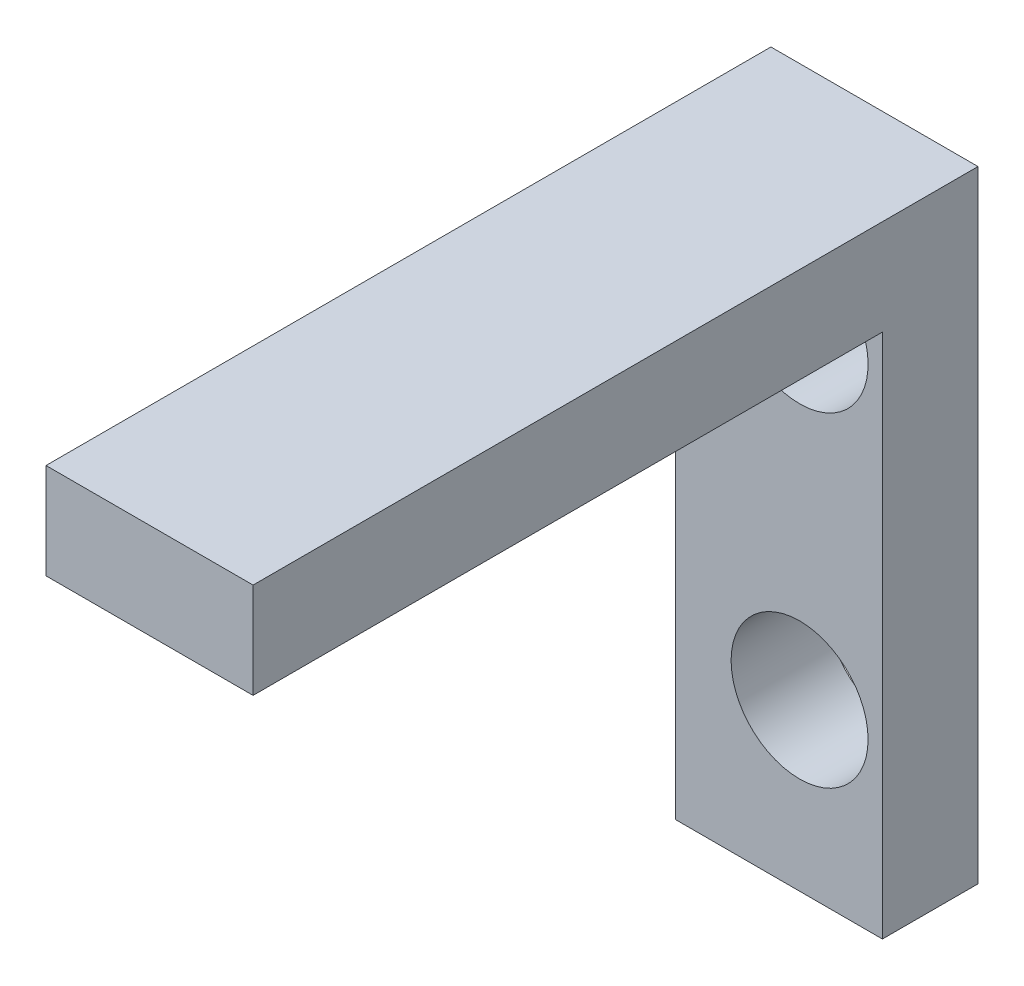
ISO-10303-21;
HEADER;
FILE_DESCRIPTION(('STEP AP214'),'2;1');
FILE_NAME('part.step','',(''),(''),'','','');
FILE_SCHEMA(('AUTOMOTIVE_DESIGN { 1 0 10303 214 1 1 1 1 }'));
ENDSEC;
DATA;
#1=APPLICATION_CONTEXT('core data for automotive mechanical design processes');
#2=APPLICATION_PROTOCOL_DEFINITION('international standard','automotive_design',2000,#1);
#3=PRODUCT_CONTEXT('',#1,'mechanical');
#4=PRODUCT('Part','Part','',(#3));
#5=PRODUCT_RELATED_PRODUCT_CATEGORY('part','',(#4));
#6=PRODUCT_DEFINITION_FORMATION('','',#4);
#7=PRODUCT_DEFINITION_CONTEXT('part definition',#1,'design');
#8=PRODUCT_DEFINITION('design','',#6,#7);
#9=PRODUCT_DEFINITION_SHAPE('','',#8);
#10=(LENGTH_UNIT() NAMED_UNIT(*) SI_UNIT(.MILLI.,.METRE.));
#11=(NAMED_UNIT(*) PLANE_ANGLE_UNIT() SI_UNIT($,.RADIAN.));
#12=(NAMED_UNIT(*) SI_UNIT($,.STERADIAN.) SOLID_ANGLE_UNIT());
#13=UNCERTAINTY_MEASURE_WITH_UNIT(LENGTH_MEASURE(1.E-05),#10,'distance_accuracy_value','');
#14=(GEOMETRIC_REPRESENTATION_CONTEXT(3) GLOBAL_UNCERTAINTY_ASSIGNED_CONTEXT((#13)) GLOBAL_UNIT_ASSIGNED_CONTEXT((#10,
#11,#12)) REPRESENTATION_CONTEXT('',''));
#15=CARTESIAN_POINT('',(0.,0.,0.));
#16=DIRECTION('',(0.,0.,1.));
#17=DIRECTION('',(1.,0.,0.));
#18=AXIS2_PLACEMENT_3D('',#15,#16,#17);
#19=CARTESIAN_POINT('',(0.,0.,3.));
#20=DIRECTION('',(0.,0.,1.));
#21=DIRECTION('',(1.,0.,0.));
#22=AXIS2_PLACEMENT_3D('',#19,#20,#21);
#23=PLANE('',#22);
#24=CARTESIAN_POINT('',(-30.1826296275651,-10.5210841512076,3.));
#25=DIRECTION('',(0.,0.,1.));
#26=DIRECTION('',(1.,0.,0.));
#27=AXIS2_PLACEMENT_3D('',#24,#25,#26);
#28=CIRCLE('',#27,2.15);
#29=CARTESIAN_POINT('',(-32.0300913961896,-9.42136372606727,3.));
#30=VERTEX_POINT('',#29);
#31=CARTESIAN_POINT('',(-28.3351678589407,-9.42136372606727,3.));
#32=VERTEX_POINT('',#31);
#33=EDGE_CURVE('E105',#30,#32,#28,.T.);
#34=ORIENTED_EDGE('',*,*,#33,.F.);
#35=DIRECTION('',(-1.,0.,0.));
#36=VECTOR('',#35,1.);
#37=CARTESIAN_POINT('',(-27.5826296275652,-9.42136372606727,3.));
#38=LINE('',#37,#36);
#39=CARTESIAN_POINT('',(-34.0826296275651,-9.42136372606727,3.));
#40=VERTEX_POINT('',#39);
#41=EDGE_CURVE('E54',#30,#40,#38,.T.);
#42=ORIENTED_EDGE('',*,*,#41,.T.);
#43=DIRECTION('',(0.,-1.,0.));
#44=VECTOR('',#43,1.);
#45=CARTESIAN_POINT('',(-34.0826296275651,-6.42136372606727,3.));
#46=LINE('',#45,#44);
#47=CARTESIAN_POINT('',(-34.0826296275651,-25.9213637260673,3.));
#48=VERTEX_POINT('',#47);
#49=EDGE_CURVE('E137',#40,#48,#46,.T.);
#50=ORIENTED_EDGE('',*,*,#49,.T.);
#51=DIRECTION('',(1.,0.,0.));
#52=VECTOR('',#51,1.);
#53=CARTESIAN_POINT('',(-34.0826296275651,-25.9213637260673,3.));
#54=LINE('',#53,#52);
#55=CARTESIAN_POINT('',(-27.5826296275652,-25.9213637260673,3.));
#56=VERTEX_POINT('',#55);
#57=EDGE_CURVE('E139',#48,#56,#54,.T.);
#58=ORIENTED_EDGE('',*,*,#57,.T.);
#59=DIRECTION('',(0.,1.,0.));
#60=VECTOR('',#59,1.);
#61=CARTESIAN_POINT('',(-27.5826296275652,-6.42136372606727,3.));
#62=LINE('',#61,#60);
#63=CARTESIAN_POINT('',(-27.5826296275652,-9.42136372606727,3.));
#64=VERTEX_POINT('',#63);
#65=EDGE_CURVE('E142',#56,#64,#62,.T.);
#66=ORIENTED_EDGE('',*,*,#65,.T.);
#67=EDGE_CURVE('E113',#64,#32,#38,.T.);
#68=ORIENTED_EDGE('',*,*,#67,.T.);
#69=EDGE_LOOP('',(#34,#42,#50,#58,#66,#68));
#70=FACE_BOUND('',#69,.T.);
#71=CARTESIAN_POINT('',(-30.1826296275651,-20.7210841512076,3.));
#72=DIRECTION('',(0.,0.,1.));
#73=DIRECTION('',(1.,0.,0.));
#74=AXIS2_PLACEMENT_3D('',#71,#72,#73);
#75=CIRCLE('',#74,2.15);
#76=CARTESIAN_POINT('',(-28.0326296275652,-20.7210841512076,3.));
#77=VERTEX_POINT('',#76);
#78=EDGE_CURVE('E118',#77,#77,#75,.T.);
#79=ORIENTED_EDGE('',*,*,#78,.F.);
#80=EDGE_LOOP('',(#79));
#81=FACE_BOUND('',#80,.T.);
#82=ADVANCED_FACE('F32',(#70,#81),#23,.T.);
#83=CARTESIAN_POINT('',(-34.0826296275651,-6.42136372606727,3.));
#84=DIRECTION('',(1.,0.,0.));
#85=DIRECTION('',(0.,0.,-1.));
#86=AXIS2_PLACEMENT_3D('',#83,#84,#85);
#87=PLANE('',#86);
#88=DIRECTION('',(0.,-1.,0.));
#89=VECTOR('',#88,1.);
#90=CARTESIAN_POINT('',(-34.0826296275651,-6.42136372606727,0.));
#91=LINE('',#90,#89);
#92=CARTESIAN_POINT('',(-34.0826296275651,-6.42136372606727,0.));
#93=VERTEX_POINT('',#92);
#94=CARTESIAN_POINT('',(-34.0826296275651,-25.9213637260673,0.));
#95=VERTEX_POINT('',#94);
#96=EDGE_CURVE('E134',#93,#95,#91,.T.);
#97=ORIENTED_EDGE('',*,*,#96,.T.);
#98=DIRECTION('',(0.,0.,-1.));
#99=VECTOR('',#98,1.);
#100=CARTESIAN_POINT('',(-34.0826296275651,-25.9213637260673,3.));
#101=LINE('',#100,#99);
#102=EDGE_CURVE('E100',#48,#95,#101,.T.);
#103=ORIENTED_EDGE('',*,*,#102,.F.);
#104=ORIENTED_EDGE('',*,*,#49,.F.);
#105=DIRECTION('',(0.,0.,1.));
#106=VECTOR('',#105,1.);
#107=CARTESIAN_POINT('',(-34.0826296275652,-9.42136372606727,22.7547297261879));
#108=LINE('',#107,#106);
#109=CARTESIAN_POINT('',(-34.0826296275652,-9.42136372606727,22.7547297261879));
#110=VERTEX_POINT('',#109);
#111=EDGE_CURVE('E111',#40,#110,#108,.T.);
#112=ORIENTED_EDGE('',*,*,#111,.T.);
#113=DIRECTION('',(0.,1.,0.));
#114=VECTOR('',#113,1.);
#115=CARTESIAN_POINT('',(-34.0826296275652,-9.42136372606727,22.7547297261879));
#116=LINE('',#115,#114);
#117=CARTESIAN_POINT('',(-34.0826296275652,-6.42136372606727,22.7547297261879));
#118=VERTEX_POINT('',#117);
#119=EDGE_CURVE('E129',#110,#118,#116,.T.);
#120=ORIENTED_EDGE('',*,*,#119,.T.);
#121=DIRECTION('',(0.,0.,-1.));
#122=VECTOR('',#121,1.);
#123=CARTESIAN_POINT('',(-34.0826296275651,-6.42136372606727,3.));
#124=LINE('',#123,#122);
#125=EDGE_CURVE('E145',#118,#93,#124,.T.);
#126=ORIENTED_EDGE('',*,*,#125,.T.);
#127=EDGE_LOOP('',(#97,#103,#104,#112,#120,#126));
#128=FACE_BOUND('',#127,.T.);
#129=ADVANCED_FACE('F34',(#128),#87,.F.);
#130=CARTESIAN_POINT('',(-34.0826296275651,-25.9213637260673,3.));
#131=DIRECTION('',(0.,1.,0.));
#132=DIRECTION('',(0.,0.,1.));
#133=AXIS2_PLACEMENT_3D('',#130,#131,#132);
#134=PLANE('',#133);
#135=DIRECTION('',(1.,0.,0.));
#136=VECTOR('',#135,1.);
#137=CARTESIAN_POINT('',(-34.0826296275651,-25.9213637260673,0.));
#138=LINE('',#137,#136);
#139=CARTESIAN_POINT('',(-27.5826296275652,-25.9213637260673,0.));
#140=VERTEX_POINT('',#139);
#141=EDGE_CURVE('E148',#95,#140,#138,.T.);
#142=ORIENTED_EDGE('',*,*,#141,.T.);
#143=DIRECTION('',(0.,0.,-1.));
#144=VECTOR('',#143,1.);
#145=CARTESIAN_POINT('',(-27.5826296275652,-25.9213637260673,3.));
#146=LINE('',#145,#144);
#147=EDGE_CURVE('E158',#56,#140,#146,.T.);
#148=ORIENTED_EDGE('',*,*,#147,.F.);
#149=ORIENTED_EDGE('',*,*,#57,.F.);
#150=ORIENTED_EDGE('',*,*,#102,.T.);
#151=EDGE_LOOP('',(#142,#148,#149,#150));
#152=FACE_BOUND('',#151,.T.);
#153=ADVANCED_FACE('F165',(#152),#134,.F.);
#154=CARTESIAN_POINT('',(-27.5826296275652,-6.42136372606727,3.));
#155=DIRECTION('',(-1.,0.,0.));
#156=DIRECTION('',(0.,-1.,0.));
#157=AXIS2_PLACEMENT_3D('',#154,#155,#156);
#158=PLANE('',#157);
#159=DIRECTION('',(0.,1.,0.));
#160=VECTOR('',#159,1.);
#161=CARTESIAN_POINT('',(-27.5826296275652,-6.42136372606727,0.));
#162=LINE('',#161,#160);
#163=CARTESIAN_POINT('',(-27.5826296275652,-6.42136372606727,0.));
#164=VERTEX_POINT('',#163);
#165=EDGE_CURVE('E150',#140,#164,#162,.T.);
#166=ORIENTED_EDGE('',*,*,#165,.T.);
#167=DIRECTION('',(0.,0.,-1.));
#168=VECTOR('',#167,1.);
#169=CARTESIAN_POINT('',(-27.5826296275652,-6.42136372606727,3.));
#170=LINE('',#169,#168);
#171=CARTESIAN_POINT('',(-27.5826296275652,-6.42136372606727,22.7547297261879));
#172=VERTEX_POINT('',#171);
#173=EDGE_CURVE('E155',#172,#164,#170,.T.);
#174=ORIENTED_EDGE('',*,*,#173,.F.);
#175=DIRECTION('',(0.,1.,0.));
#176=VECTOR('',#175,1.);
#177=CARTESIAN_POINT('',(-27.5826296275652,-9.42136372606727,22.7547297261879));
#178=LINE('',#177,#176);
#179=CARTESIAN_POINT('',(-27.5826296275652,-9.42136372606727,22.7547297261879));
#180=VERTEX_POINT('',#179);
#181=EDGE_CURVE('E131',#180,#172,#178,.T.);
#182=ORIENTED_EDGE('',*,*,#181,.F.);
#183=DIRECTION('',(0.,0.,-1.));
#184=VECTOR('',#183,1.);
#185=CARTESIAN_POINT('',(-27.5826296275652,-9.42136372606727,3.));
#186=LINE('',#185,#184);
#187=EDGE_CURVE('E127',#180,#64,#186,.T.);
#188=ORIENTED_EDGE('',*,*,#187,.T.);
#189=ORIENTED_EDGE('',*,*,#65,.F.);
#190=ORIENTED_EDGE('',*,*,#147,.T.);
#191=EDGE_LOOP('',(#166,#174,#182,#188,#189,#190));
#192=FACE_BOUND('',#191,.T.);
#193=ADVANCED_FACE('F174',(#192),#158,.F.);
#194=CARTESIAN_POINT('',(-34.0826296275651,-6.42136372606727,3.));
#195=DIRECTION('',(0.,-1.,0.));
#196=DIRECTION('',(0.,0.,-1.));
#197=AXIS2_PLACEMENT_3D('',#194,#195,#196);
#198=PLANE('',#197);
#199=DIRECTION('',(-1.,0.,0.));
#200=VECTOR('',#199,1.);
#201=CARTESIAN_POINT('',(-34.0826296275651,-6.42136372606727,0.));
#202=LINE('',#201,#200);
#203=EDGE_CURVE('E140',#164,#93,#202,.T.);
#204=ORIENTED_EDGE('',*,*,#203,.T.);
#205=ORIENTED_EDGE('',*,*,#125,.F.);
#206=DIRECTION('',(1.,0.,0.));
#207=VECTOR('',#206,1.);
#208=CARTESIAN_POINT('',(-27.5826296275652,-6.42136372606727,22.7547297261879));
#209=LINE('',#208,#207);
#210=EDGE_CURVE('E114',#118,#172,#209,.T.);
#211=ORIENTED_EDGE('',*,*,#210,.T.);
#212=ORIENTED_EDGE('',*,*,#173,.T.);
#213=EDGE_LOOP('',(#204,#205,#211,#212));
#214=FACE_BOUND('',#213,.T.);
#215=ADVANCED_FACE('F177',(#214),#198,.F.);
#216=CARTESIAN_POINT('',(0.,0.,0.));
#217=DIRECTION('',(0.,0.,1.));
#218=DIRECTION('',(1.,0.,0.));
#219=AXIS2_PLACEMENT_3D('',#216,#217,#218);
#220=PLANE('',#219);
#221=CARTESIAN_POINT('',(-30.1826296275651,-10.5210841512076,0.));
#222=DIRECTION('',(0.,0.,-1.));
#223=DIRECTION('',(-1.,0.,0.));
#224=AXIS2_PLACEMENT_3D('',#221,#222,#223);
#225=CIRCLE('',#224,2.15);
#226=CARTESIAN_POINT('',(-32.3326296275651,-10.5210841512076,0.));
#227=VERTEX_POINT('',#226);
#228=EDGE_CURVE('E106',#227,#227,#225,.T.);
#229=ORIENTED_EDGE('',*,*,#228,.F.);
#230=EDGE_LOOP('',(#229));
#231=FACE_BOUND('',#230,.T.);
#232=CARTESIAN_POINT('',(-30.1826296275651,-20.7210841512076,0.));
#233=DIRECTION('',(0.,0.,-1.));
#234=DIRECTION('',(-1.,0.,0.));
#235=AXIS2_PLACEMENT_3D('',#232,#233,#234);
#236=CIRCLE('',#235,2.15);
#237=CARTESIAN_POINT('',(-32.3326296275651,-20.7210841512076,0.));
#238=VERTEX_POINT('',#237);
#239=EDGE_CURVE('E185',#238,#238,#236,.T.);
#240=ORIENTED_EDGE('',*,*,#239,.F.);
#241=EDGE_LOOP('',(#240));
#242=FACE_BOUND('',#241,.T.);
#243=ORIENTED_EDGE('',*,*,#96,.F.);
#244=ORIENTED_EDGE('',*,*,#203,.F.);
#245=ORIENTED_EDGE('',*,*,#165,.F.);
#246=ORIENTED_EDGE('',*,*,#141,.F.);
#247=EDGE_LOOP('',(#243,#244,#245,#246));
#248=FACE_BOUND('',#247,.T.);
#249=ADVANCED_FACE('F171',(#231,#242,#248),#220,.F.);
#250=CARTESIAN_POINT('',(-27.5826296275652,-9.42136372606727,22.7547297261879));
#251=DIRECTION('',(0.,0.,1.));
#252=DIRECTION('',(1.,0.,0.));
#253=AXIS2_PLACEMENT_3D('',#250,#251,#252);
#254=PLANE('',#253);
#255=ORIENTED_EDGE('',*,*,#210,.F.);
#256=ORIENTED_EDGE('',*,*,#119,.F.);
#257=DIRECTION('',(1.,0.,0.));
#258=VECTOR('',#257,1.);
#259=CARTESIAN_POINT('',(-27.5826296275652,-9.42136372606727,22.7547297261879));
#260=LINE('',#259,#258);
#261=EDGE_CURVE('E124',#110,#180,#260,.T.);
#262=ORIENTED_EDGE('',*,*,#261,.T.);
#263=ORIENTED_EDGE('',*,*,#181,.T.);
#264=EDGE_LOOP('',(#255,#256,#262,#263));
#265=FACE_BOUND('',#264,.T.);
#266=ADVANCED_FACE('F180',(#265),#254,.T.);
#267=CARTESIAN_POINT('',(0.,-9.42136372606727,0.));
#268=DIRECTION('',(0.,-1.,0.));
#269=DIRECTION('',(0.,0.,-1.));
#270=AXIS2_PLACEMENT_3D('',#267,#268,#269);
#271=PLANE('',#270);
#272=DIRECTION('',(0.,0.,-1.));
#273=VECTOR('',#272,1.);
#274=CARTESIAN_POINT('',(-32.0300913961896,-9.42136372606727,11.));
#275=LINE('',#274,#273);
#276=CARTESIAN_POINT('',(-32.0300913961896,-9.42136372606727,11.));
#277=VERTEX_POINT('',#276);
#278=EDGE_CURVE('E11',#277,#30,#275,.T.);
#279=ORIENTED_EDGE('',*,*,#278,.F.);
#280=DIRECTION('',(1.,0.,0.));
#281=VECTOR('',#280,1.);
#282=CARTESIAN_POINT('',(0.,-9.42136372606727,11.));
#283=LINE('',#282,#281);
#284=CARTESIAN_POINT('',(-28.3351678589407,-9.42136372606727,11.));
#285=VERTEX_POINT('',#284);
#286=EDGE_CURVE('E95',#277,#285,#283,.T.);
#287=ORIENTED_EDGE('',*,*,#286,.T.);
#288=DIRECTION('',(0.,0.,-1.));
#289=VECTOR('',#288,1.);
#290=CARTESIAN_POINT('',(-28.3351678589407,-9.42136372606727,11.));
#291=LINE('',#290,#289);
#292=EDGE_CURVE('E40',#32,#285,#291,.F.);
#293=ORIENTED_EDGE('',*,*,#292,.F.);
#294=ORIENTED_EDGE('',*,*,#67,.F.);
#295=ORIENTED_EDGE('',*,*,#187,.F.);
#296=ORIENTED_EDGE('',*,*,#261,.F.);
#297=ORIENTED_EDGE('',*,*,#111,.F.);
#298=ORIENTED_EDGE('',*,*,#41,.F.);
#299=EDGE_LOOP('',(#279,#287,#293,#294,#295,#296,#297,#298));
#300=FACE_BOUND('',#299,.T.);
#301=ADVANCED_FACE('F108',(#300),#271,.T.);
#302=CARTESIAN_POINT('',(-30.1826296275651,-10.5210841512076,11.));
#303=DIRECTION('',(0.,0.,-1.));
#304=DIRECTION('',(-1.,0.,0.));
#305=AXIS2_PLACEMENT_3D('',#302,#303,#304);
#306=CYLINDRICAL_SURFACE('',#305,2.15);
#307=ORIENTED_EDGE('',*,*,#278,.T.);
#308=ORIENTED_EDGE('',*,*,#33,.T.);
#309=ORIENTED_EDGE('',*,*,#292,.T.);
#310=CARTESIAN_POINT('',(-30.1826296275651,-10.5210841512076,11.));
#311=DIRECTION('',(0.,0.,-1.));
#312=DIRECTION('',(-1.,0.,0.));
#313=AXIS2_PLACEMENT_3D('',#310,#311,#312);
#314=CIRCLE('',#313,2.15);
#315=EDGE_CURVE('E46',#277,#285,#314,.T.);
#316=ORIENTED_EDGE('',*,*,#315,.F.);
#317=EDGE_LOOP('',(#307,#308,#309,#316));
#318=FACE_BOUND('',#317,.T.);
#319=ORIENTED_EDGE('',*,*,#228,.T.);
#320=EDGE_LOOP('',(#319));
#321=FACE_BOUND('',#320,.T.);
#322=ADVANCED_FACE('F103',(#318,#321),#306,.F.);
#323=CARTESIAN_POINT('',(-30.1826296275651,-10.5210841512076,11.));
#324=DIRECTION('',(0.,0.,-1.));
#325=DIRECTION('',(-1.,0.,0.));
#326=AXIS2_PLACEMENT_3D('',#323,#324,#325);
#327=PLANE('',#326);
#328=ORIENTED_EDGE('',*,*,#315,.T.);
#329=ORIENTED_EDGE('',*,*,#286,.F.);
#330=EDGE_LOOP('',(#328,#329));
#331=FACE_BOUND('',#330,.T.);
#332=ADVANCED_FACE('F96',(#331),#327,.T.);
#333=CARTESIAN_POINT('',(-30.1826296275651,-20.7210841512076,11.));
#334=DIRECTION('',(0.,0.,-1.));
#335=DIRECTION('',(-1.,0.,0.));
#336=AXIS2_PLACEMENT_3D('',#333,#334,#335);
#337=CYLINDRICAL_SURFACE('',#336,2.15);
#338=ORIENTED_EDGE('',*,*,#78,.T.);
#339=EDGE_LOOP('',(#338));
#340=FACE_BOUND('',#339,.T.);
#341=ORIENTED_EDGE('',*,*,#239,.T.);
#342=EDGE_LOOP('',(#341));
#343=FACE_BOUND('',#342,.T.);
#344=ADVANCED_FACE('F196',(#340,#343),#337,.F.);
#345=CLOSED_SHELL('',(#82,#129,#153,#193,#215,#249,#266,#301,#322,#332,#344));
#346=MANIFOLD_SOLID_BREP('B2',#345);
#347=ADVANCED_BREP_SHAPE_REPRESENTATION('',(#18,#346),#14);
#348=SHAPE_DEFINITION_REPRESENTATION(#9,#347);
ENDSEC;
END-ISO-10303-21;
